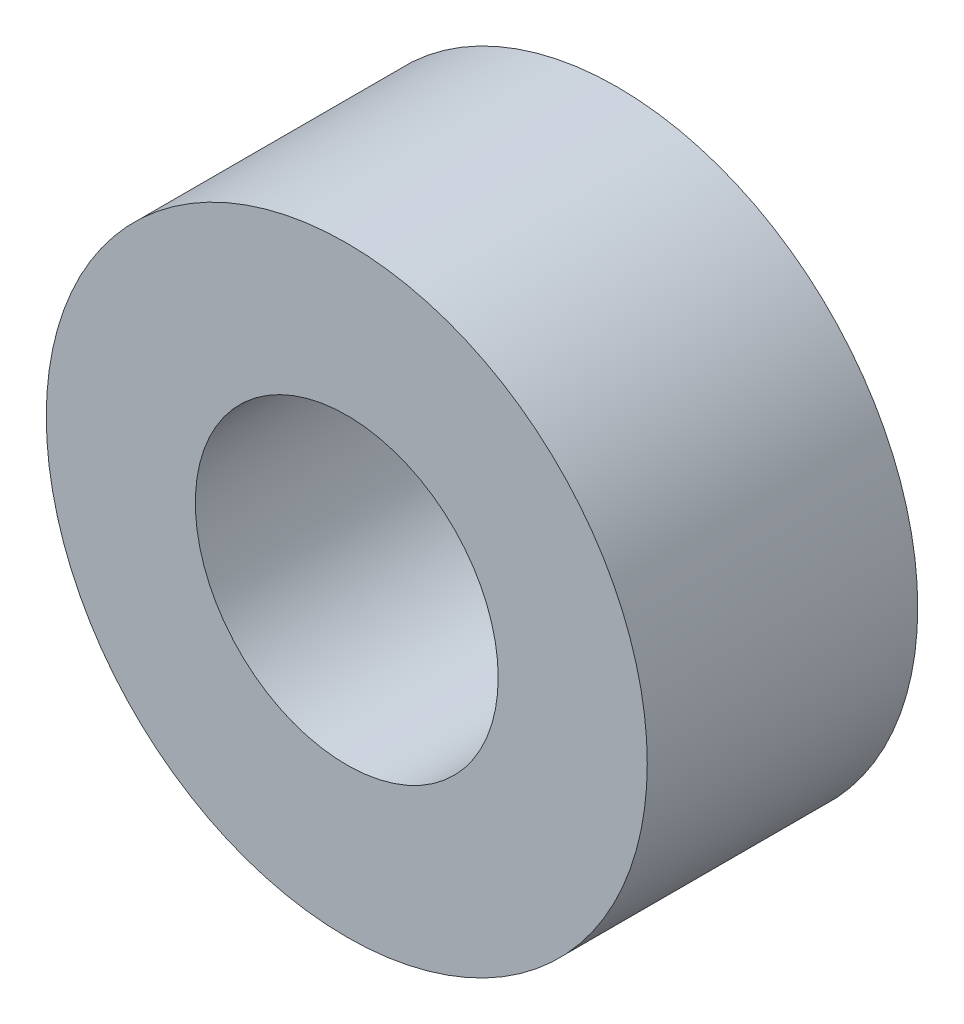
ISO-10303-21;
HEADER;
FILE_DESCRIPTION(('STEP AP214'),'2;1');
FILE_NAME('part.step','',(''),(''),'','','');
FILE_SCHEMA(('AUTOMOTIVE_DESIGN { 1 0 10303 214 1 1 1 1 }'));
ENDSEC;
DATA;
#1=APPLICATION_CONTEXT('core data for automotive mechanical design processes');
#2=APPLICATION_PROTOCOL_DEFINITION('international standard','automotive_design',2000,#1);
#3=PRODUCT_CONTEXT('',#1,'mechanical');
#4=PRODUCT('Part','Part','',(#3));
#5=PRODUCT_RELATED_PRODUCT_CATEGORY('part','',(#4));
#6=PRODUCT_DEFINITION_FORMATION('','',#4);
#7=PRODUCT_DEFINITION_CONTEXT('part definition',#1,'design');
#8=PRODUCT_DEFINITION('design','',#6,#7);
#9=PRODUCT_DEFINITION_SHAPE('','',#8);
#10=(LENGTH_UNIT() NAMED_UNIT(*) SI_UNIT(.MILLI.,.METRE.));
#11=(NAMED_UNIT(*) PLANE_ANGLE_UNIT() SI_UNIT($,.RADIAN.));
#12=(NAMED_UNIT(*) SI_UNIT($,.STERADIAN.) SOLID_ANGLE_UNIT());
#13=UNCERTAINTY_MEASURE_WITH_UNIT(LENGTH_MEASURE(1.E-05),#10,'distance_accuracy_value','');
#14=(GEOMETRIC_REPRESENTATION_CONTEXT(3) GLOBAL_UNCERTAINTY_ASSIGNED_CONTEXT((#13)) GLOBAL_UNIT_ASSIGNED_CONTEXT((#10,
#11,#12)) REPRESENTATION_CONTEXT('',''));
#15=CARTESIAN_POINT('',(0.,0.,0.));
#16=DIRECTION('',(0.,0.,1.));
#17=DIRECTION('',(1.,0.,0.));
#18=AXIS2_PLACEMENT_3D('',#15,#16,#17);
#19=CARTESIAN_POINT('',(0.,0.,7.14375));
#20=DIRECTION('',(0.,0.,1.));
#21=DIRECTION('',(1.,0.,0.));
#22=AXIS2_PLACEMENT_3D('',#19,#20,#21);
#23=PLANE('',#22);
#24=CARTESIAN_POINT('',(0.,0.,7.14375));
#25=DIRECTION('',(0.,0.,1.));
#26=DIRECTION('',(1.,0.,0.));
#27=AXIS2_PLACEMENT_3D('',#24,#25,#26);
#28=CIRCLE('',#27,7.9375);
#29=CARTESIAN_POINT('',(7.9375,0.,7.14375));
#30=VERTEX_POINT('',#29);
#31=EDGE_CURVE('E10',#30,#30,#28,.T.);
#32=ORIENTED_EDGE('',*,*,#31,.T.);
#33=EDGE_LOOP('',(#32));
#34=FACE_BOUND('',#33,.T.);
#35=CARTESIAN_POINT('',(0.,0.,7.14375));
#36=DIRECTION('',(0.,0.,1.));
#37=DIRECTION('',(1.,0.,0.));
#38=AXIS2_PLACEMENT_3D('',#35,#36,#37);
#39=CIRCLE('',#38,4.);
#40=CARTESIAN_POINT('',(4.,0.,7.14375));
#41=VERTEX_POINT('',#40);
#42=EDGE_CURVE('E56',#41,#41,#39,.T.);
#43=ORIENTED_EDGE('',*,*,#42,.F.);
#44=EDGE_LOOP('',(#43));
#45=FACE_BOUND('',#44,.T.);
#46=ADVANCED_FACE('F43',(#34,#45),#23,.T.);
#47=CARTESIAN_POINT('',(0.,0.,0.));
#48=DIRECTION('',(0.,0.,1.));
#49=DIRECTION('',(1.,0.,0.));
#50=AXIS2_PLACEMENT_3D('',#47,#48,#49);
#51=PLANE('',#50);
#52=CARTESIAN_POINT('',(0.,0.,0.));
#53=DIRECTION('',(0.,0.,1.));
#54=DIRECTION('',(1.,0.,0.));
#55=AXIS2_PLACEMENT_3D('',#52,#53,#54);
#56=CIRCLE('',#55,7.9375);
#57=CARTESIAN_POINT('',(7.9375,0.,0.));
#58=VERTEX_POINT('',#57);
#59=EDGE_CURVE('E47',#58,#58,#56,.T.);
#60=ORIENTED_EDGE('',*,*,#59,.F.);
#61=EDGE_LOOP('',(#60));
#62=FACE_BOUND('',#61,.T.);
#63=CARTESIAN_POINT('',(0.,0.,0.));
#64=DIRECTION('',(0.,0.,1.));
#65=DIRECTION('',(1.,0.,0.));
#66=AXIS2_PLACEMENT_3D('',#63,#64,#65);
#67=CIRCLE('',#66,4.);
#68=CARTESIAN_POINT('',(4.,0.,0.));
#69=VERTEX_POINT('',#68);
#70=EDGE_CURVE('E58',#69,#69,#67,.T.);
#71=ORIENTED_EDGE('',*,*,#70,.T.);
#72=EDGE_LOOP('',(#71));
#73=FACE_BOUND('',#72,.T.);
#74=ADVANCED_FACE('F70',(#62,#73),#51,.F.);
#75=CARTESIAN_POINT('',(0.,0.,7.14375));
#76=DIRECTION('',(0.,0.,-1.));
#77=DIRECTION('',(-1.,0.,0.));
#78=AXIS2_PLACEMENT_3D('',#75,#76,#77);
#79=CYLINDRICAL_SURFACE('',#78,7.9375);
#80=ORIENTED_EDGE('',*,*,#31,.F.);
#81=EDGE_LOOP('',(#80));
#82=FACE_BOUND('',#81,.T.);
#83=ORIENTED_EDGE('',*,*,#59,.T.);
#84=EDGE_LOOP('',(#83));
#85=FACE_BOUND('',#84,.T.);
#86=ADVANCED_FACE('F45',(#82,#85),#79,.T.);
#87=CARTESIAN_POINT('',(0.,0.,7.14375));
#88=DIRECTION('',(0.,0.,-1.));
#89=DIRECTION('',(-1.,0.,0.));
#90=AXIS2_PLACEMENT_3D('',#87,#88,#89);
#91=CYLINDRICAL_SURFACE('',#90,4.);
#92=ORIENTED_EDGE('',*,*,#42,.T.);
#93=EDGE_LOOP('',(#92));
#94=FACE_BOUND('',#93,.T.);
#95=ORIENTED_EDGE('',*,*,#70,.F.);
#96=EDGE_LOOP('',(#95));
#97=FACE_BOUND('',#96,.T.);
#98=ADVANCED_FACE('F66',(#94,#97),#91,.F.);
#99=CLOSED_SHELL('',(#46,#74,#86,#98));
#100=MANIFOLD_SOLID_BREP('B2',#99);
#101=ADVANCED_BREP_SHAPE_REPRESENTATION('',(#18,#100),#14);
#102=SHAPE_DEFINITION_REPRESENTATION(#9,#101);
ENDSEC;
END-ISO-10303-21;
